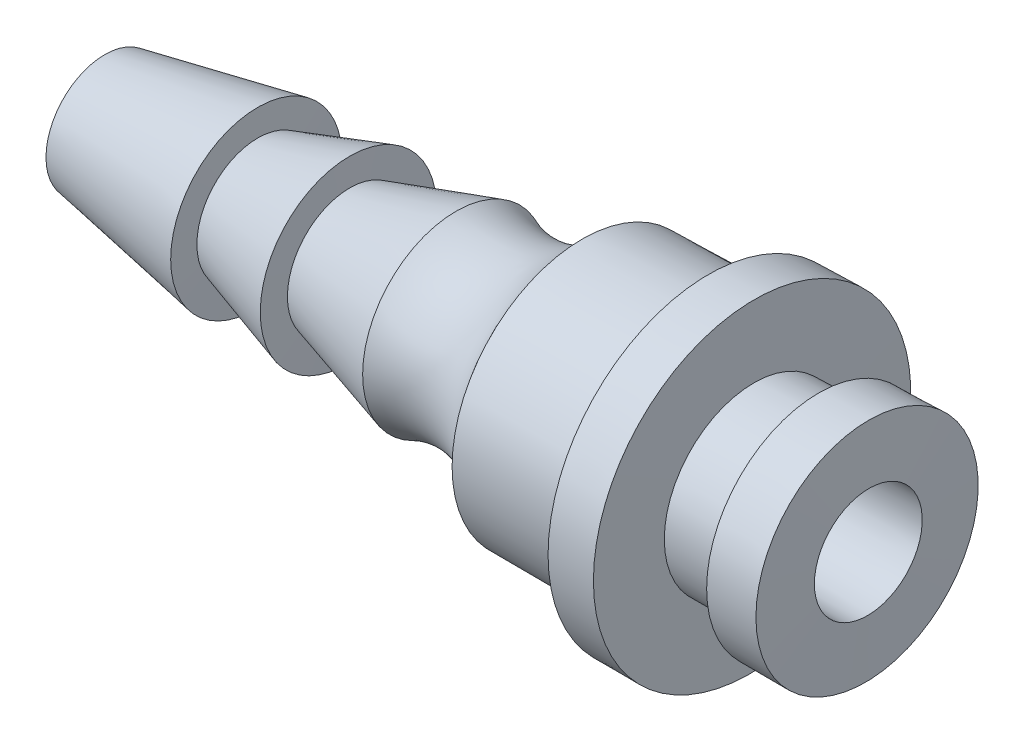
ISO-10303-21;
HEADER;
FILE_DESCRIPTION(('STEP AP214'),'2;1');
FILE_NAME('part.step','',(''),(''),'','','');
FILE_SCHEMA(('AUTOMOTIVE_DESIGN { 1 0 10303 214 1 1 1 1 }'));
ENDSEC;
DATA;
#1=APPLICATION_CONTEXT('core data for automotive mechanical design processes');
#2=APPLICATION_PROTOCOL_DEFINITION('international standard','automotive_design',2000,#1);
#3=PRODUCT_CONTEXT('',#1,'mechanical');
#4=PRODUCT('Part','Part','',(#3));
#5=PRODUCT_RELATED_PRODUCT_CATEGORY('part','',(#4));
#6=PRODUCT_DEFINITION_FORMATION('','',#4);
#7=PRODUCT_DEFINITION_CONTEXT('part definition',#1,'design');
#8=PRODUCT_DEFINITION('design','',#6,#7);
#9=PRODUCT_DEFINITION_SHAPE('','',#8);
#10=(LENGTH_UNIT() NAMED_UNIT(*) SI_UNIT(.MILLI.,.METRE.));
#11=(NAMED_UNIT(*) PLANE_ANGLE_UNIT() SI_UNIT($,.RADIAN.));
#12=(NAMED_UNIT(*) SI_UNIT($,.STERADIAN.) SOLID_ANGLE_UNIT());
#13=UNCERTAINTY_MEASURE_WITH_UNIT(LENGTH_MEASURE(1.E-05),#10,'distance_accuracy_value','');
#14=(GEOMETRIC_REPRESENTATION_CONTEXT(3) GLOBAL_UNCERTAINTY_ASSIGNED_CONTEXT((#13)) GLOBAL_UNIT_ASSIGNED_CONTEXT((#10,
#11,#12)) REPRESENTATION_CONTEXT('',''));
#15=CARTESIAN_POINT('',(0.,0.,0.));
#16=DIRECTION('',(0.,0.,1.));
#17=DIRECTION('',(1.,0.,0.));
#18=AXIS2_PLACEMENT_3D('',#15,#16,#17);
#19=CARTESIAN_POINT('',(-11.5054347686072,0.,0.111037784482097));
#20=DIRECTION('',(-0.999901042595065,0.,0.014067871811395));
#21=DIRECTION('',(0.014067871811395,0.,0.999901042595065));
#22=AXIS2_PLACEMENT_3D('',#19,#20,#21);
#23=CONICAL_SURFACE('',#22,0.849915886205805,1.5567279909251);
#24=CARTESIAN_POINT('',(-11.515421969188,0.,0.111178297044382));
#25=DIRECTION('',(-0.999901042595065,0.,0.014067871811395));
#26=DIRECTION('',(0.014067871811395,0.,0.999901042595065));
#27=AXIS2_PLACEMENT_3D('',#24,#25,#26);
#28=CIRCLE('',#27,1.5598456264483);
#29=CARTESIAN_POINT('',(-11.4934782608696,0.,1.67086956521739));
#30=VERTEX_POINT('',#29);
#31=EDGE_CURVE('E93',#30,#30,#28,.T.);
#32=ORIENTED_EDGE('',*,*,#31,.T.);
#33=EDGE_LOOP('',(#32));
#34=FACE_BOUND('',#33,.T.);
#35=CARTESIAN_POINT('',(-11.5054347686072,0.,0.111037784482097));
#36=DIRECTION('',(-0.999901042595065,0.,0.014067871811395));
#37=DIRECTION('',(0.014067871811395,0.,0.999901042595065));
#38=AXIS2_PLACEMENT_3D('',#35,#36,#37);
#39=CIRCLE('',#38,0.849915886205805);
#40=CARTESIAN_POINT('',(-11.4934782608696,0.,0.960869565217391));
#41=VERTEX_POINT('',#40);
#42=EDGE_CURVE('E10',#41,#41,#39,.T.);
#43=ORIENTED_EDGE('',*,*,#42,.F.);
#44=EDGE_LOOP('',(#43));
#45=FACE_BOUND('',#44,.T.);
#46=ADVANCED_FACE('F35',(#34,#45),#23,.F.);
#47=CARTESIAN_POINT('',(1.39201225666963,0.,-0.0704198035357706));
#48=DIRECTION('',(0.999901042595065,0.,-0.014067871811395));
#49=DIRECTION('',(-0.014067871811395,0.,-0.999901042595065));
#50=AXIS2_PLACEMENT_3D('',#47,#48,#49);
#51=CONICAL_SURFACE('',#50,1.0313914325728,0.014068335869793);
#52=ORIENTED_EDGE('',*,*,#42,.T.);
#53=EDGE_LOOP('',(#52));
#54=FACE_BOUND('',#53,.T.);
#55=CARTESIAN_POINT('',(1.39201225666963,0.,-0.0704198035357706));
#56=DIRECTION('',(-0.999901042595065,0.,0.014067871811395));
#57=DIRECTION('',(0.014067871811395,0.,0.999901042595065));
#58=AXIS2_PLACEMENT_3D('',#55,#56,#57);
#59=CIRCLE('',#58,1.0313914325728);
#60=CARTESIAN_POINT('',(1.40652173913043,0.,0.960869565217391));
#61=VERTEX_POINT('',#60);
#62=EDGE_CURVE('E41',#61,#61,#59,.T.);
#63=ORIENTED_EDGE('',*,*,#62,.F.);
#64=EDGE_LOOP('',(#63));
#65=FACE_BOUND('',#64,.T.);
#66=ADVANCED_FACE('F111',(#54,#65),#51,.F.);
#67=CARTESIAN_POINT('',(1.80711824137701,0.,-0.0762600392513475));
#68=DIRECTION('',(0.999901042595065,0.,-0.014067871811395));
#69=DIRECTION('',(-0.014067871811395,0.,-0.999901042595065));
#70=AXIS2_PLACEMENT_3D('',#67,#68,#69);
#71=CONICAL_SURFACE('',#70,1.35632493531116,0.664099637825054);
#72=ORIENTED_EDGE('',*,*,#62,.T.);
#73=EDGE_LOOP('',(#72));
#74=FACE_BOUND('',#73,.T.);
#75=CARTESIAN_POINT('',(1.80711824137701,0.,-0.0762600392513475));
#76=DIRECTION('',(-0.999901042595065,0.,0.014067871811395));
#77=DIRECTION('',(0.014067871811395,0.,0.999901042595065));
#78=AXIS2_PLACEMENT_3D('',#75,#76,#77);
#79=CIRCLE('',#78,1.35632493531116);
#80=CARTESIAN_POINT('',(1.82619884670156,0.,1.27993067766396));
#81=VERTEX_POINT('',#80);
#82=EDGE_CURVE('E45',#81,#81,#79,.T.);
#83=ORIENTED_EDGE('',*,*,#82,.F.);
#84=EDGE_LOOP('',(#83));
#85=FACE_BOUND('',#84,.T.);
#86=ADVANCED_FACE('F115',(#74,#85),#71,.F.);
#87=CARTESIAN_POINT('',(8.46459473669748,0.,-0.16992583409888));
#88=DIRECTION('',(0.999901042595065,0.,-0.014067871811395));
#89=DIRECTION('',(-0.014067871811395,0.,-0.999901042595065));
#90=AXIS2_PLACEMENT_3D('',#87,#88,#89);
#91=CONICAL_SURFACE('',#90,1.45,0.014068335869793);
#92=ORIENTED_EDGE('',*,*,#82,.T.);
#93=EDGE_LOOP('',(#92));
#94=FACE_BOUND('',#93,.T.);
#95=CARTESIAN_POINT('',(8.46459473669748,0.,-0.16992583409888));
#96=DIRECTION('',(-0.999901042595065,0.,0.014067871811395));
#97=DIRECTION('',(0.014067871811395,0.,0.999901042595065));
#98=AXIS2_PLACEMENT_3D('',#95,#96,#97);
#99=CIRCLE('',#98,1.45);
#100=CARTESIAN_POINT('',(8.484993150824,0.,1.27993067766396));
#101=VERTEX_POINT('',#100);
#102=EDGE_CURVE('E49',#101,#101,#99,.T.);
#103=ORIENTED_EDGE('',*,*,#102,.F.);
#104=EDGE_LOOP('',(#103));
#105=FACE_BOUND('',#104,.T.);
#106=ADVANCED_FACE('F119',(#94,#105),#91,.F.);
#107=CARTESIAN_POINT('',(8.43199945824019,0.,-0.169467242518854));
#108=DIRECTION('',(-0.999901042595065,0.,0.014067871811395));
#109=DIRECTION('',(0.014067871811395,0.,0.999901042595065));
#110=AXIS2_PLACEMENT_3D('',#107,#108,#109);
#111=CONICAL_SURFACE('',#110,2.98838076344962,1.54960935718367);
#112=ORIENTED_EDGE('',*,*,#102,.T.);
#113=EDGE_LOOP('',(#112));
#114=FACE_BOUND('',#113,.T.);
#115=CARTESIAN_POINT('',(8.43199945824019,0.,-0.169467242518854));
#116=DIRECTION('',(-0.999901042595065,0.,0.014067871811395));
#117=DIRECTION('',(0.014067871811395,0.,0.999901042595065));
#118=AXIS2_PLACEMENT_3D('',#115,#116,#117);
#119=CIRCLE('',#118,2.98838076344962);
#120=CARTESIAN_POINT('',(8.47403961574403,0.,2.81861779852546));
#121=VERTEX_POINT('',#120);
#122=EDGE_CURVE('E54',#121,#121,#119,.T.);
#123=ORIENTED_EDGE('',*,*,#122,.F.);
#124=EDGE_LOOP('',(#123));
#125=FACE_BOUND('',#124,.T.);
#126=ADVANCED_FACE('F125',(#114,#125),#111,.T.);
#127=CARTESIAN_POINT('',(7.12568063115012,0.,-0.151088297981882));
#128=DIRECTION('',(0.999901042595065,0.,-0.014067871811395));
#129=DIRECTION('',(-0.014067871811395,0.,-0.999901042595065));
#130=AXIS2_PLACEMENT_3D('',#127,#128,#129);
#131=CONICAL_SURFACE('',#130,2.97,0.0140683358697934);
#132=ORIENTED_EDGE('',*,*,#122,.T.);
#133=EDGE_LOOP('',(#132));
#134=FACE_BOUND('',#133,.T.);
#135=CARTESIAN_POINT('',(7.12568063115012,0.,-0.151088297981882));
#136=DIRECTION('',(-0.999901042595065,0.,0.014067871811395));
#137=DIRECTION('',(0.014067871811395,0.,0.999901042595065));
#138=AXIS2_PLACEMENT_3D('',#135,#136,#137);
#139=CIRCLE('',#138,2.97);
#140=CARTESIAN_POINT('',(7.16746221042996,0.,2.81861779852546));
#141=VERTEX_POINT('',#140);
#142=EDGE_CURVE('E57',#141,#141,#139,.T.);
#143=ORIENTED_EDGE('',*,*,#142,.F.);
#144=EDGE_LOOP('',(#143));
#145=FACE_BOUND('',#144,.T.);
#146=ADVANCED_FACE('F129',(#134,#145),#131,.T.);
#147=CARTESIAN_POINT('',(7.14029198166256,0.,-0.15129386893065));
#148=DIRECTION('',(-0.999901042595065,0.,0.014067871811395));
#149=DIRECTION('',(0.014067871811395,0.,0.999901042595065));
#150=AXIS2_PLACEMENT_3D('',#147,#148,#149);
#151=CONICAL_SURFACE('',#150,2.39891538207937,1.5452141132674);
#152=ORIENTED_EDGE('',*,*,#142,.T.);
#153=EDGE_LOOP('',(#152));
#154=FACE_BOUND('',#153,.T.);
#155=CARTESIAN_POINT('',(7.14029198166256,0.,-0.15129386893065));
#156=DIRECTION('',(-0.999901042595065,0.,0.014067871811395));
#157=DIRECTION('',(0.014067871811395,0.,0.999901042595065));
#158=AXIS2_PLACEMENT_3D('',#155,#156,#157);
#159=CIRCLE('',#158,2.39891538207937);
#160=CARTESIAN_POINT('',(7.17403961574403,0.,2.24738412270785));
#161=VERTEX_POINT('',#160);
#162=EDGE_CURVE('E60',#161,#161,#159,.T.);
#163=ORIENTED_EDGE('',*,*,#162,.F.);
#164=EDGE_LOOP('',(#163));
#165=FACE_BOUND('',#164,.T.);
#166=ADVANCED_FACE('F133',(#154,#165),#151,.F.);
#167=CARTESIAN_POINT('',(5.44062842019197,0.,-0.127380853455427));
#168=DIRECTION('',(0.999901042595065,0.,-0.014067871811395));
#169=DIRECTION('',(-0.014067871811395,0.,-0.999901042595065));
#170=AXIS2_PLACEMENT_3D('',#167,#168,#169);
#171=CONICAL_SURFACE('',#170,2.375,0.0140683358697924);
#172=ORIENTED_EDGE('',*,*,#162,.T.);
#173=EDGE_LOOP('',(#172));
#174=FACE_BOUND('',#173,.T.);
#175=CARTESIAN_POINT('',(5.44062842019197,0.,-0.127380853455427));
#176=DIRECTION('',(-0.999901042595065,0.,0.014067871811395));
#177=DIRECTION('',(0.014067871811395,0.,0.999901042595065));
#178=AXIS2_PLACEMENT_3D('',#175,#176,#177);
#179=CIRCLE('',#178,2.375);
#180=CARTESIAN_POINT('',(5.47403961574403,0.,2.24738412270785));
#181=VERTEX_POINT('',#180);
#182=EDGE_CURVE('E63',#181,#181,#179,.T.);
#183=ORIENTED_EDGE('',*,*,#182,.F.);
#184=EDGE_LOOP('',(#183));
#185=FACE_BOUND('',#184,.T.);
#186=ADVANCED_FACE('F137',(#174,#185),#171,.T.);
#187=CARTESIAN_POINT('',(5.42649537089601,0.,-0.127182011852779));
#188=DIRECTION('',(-0.999901042595065,0.,0.014067871811395));
#189=DIRECTION('',(0.014067871811395,0.,0.999901042595065));
#190=AXIS2_PLACEMENT_3D('',#187,#188,#189);
#191=CONICAL_SURFACE('',#190,4.26691180010591,1.56332547903242);
#192=ORIENTED_EDGE('',*,*,#182,.T.);
#193=EDGE_LOOP('',(#192));
#194=FACE_BOUND('',#193,.T.);
#195=CARTESIAN_POINT('',(5.42649537089601,0.,-0.127182011852779));
#196=DIRECTION('',(-0.999901042595065,0.,0.014067871811395));
#197=DIRECTION('',(0.014067871811395,0.,0.999901042595065));
#198=AXIS2_PLACEMENT_3D('',#195,#196,#197);
#199=CIRCLE('',#198,4.26691180010591);
#200=CARTESIAN_POINT('',(5.48652173913043,0.,4.13930754573431));
#201=VERTEX_POINT('',#200);
#202=EDGE_CURVE('E66',#201,#201,#199,.T.);
#203=ORIENTED_EDGE('',*,*,#202,.F.);
#204=EDGE_LOOP('',(#203));
#205=FACE_BOUND('',#204,.T.);
#206=ADVANCED_FACE('F141',(#194,#205),#191,.T.);
#207=CARTESIAN_POINT('',(4.22457560630702,0.,-0.110271885294717));
#208=DIRECTION('',(0.999901042595065,0.,-0.014067871811395));
#209=DIRECTION('',(-0.014067871811395,0.,-0.999901042595065));
#210=AXIS2_PLACEMENT_3D('',#207,#208,#209);
#211=CONICAL_SURFACE('',#210,4.25,0.0140683358697931);
#212=ORIENTED_EDGE('',*,*,#202,.T.);
#213=EDGE_LOOP('',(#212));
#214=FACE_BOUND('',#213,.T.);
#215=CARTESIAN_POINT('',(4.22457560630702,0.,-0.110271885294717));
#216=DIRECTION('',(-0.999901042595065,0.,0.014067871811395));
#217=DIRECTION('',(0.014067871811395,0.,0.999901042595065));
#218=AXIS2_PLACEMENT_3D('',#215,#216,#217);
#219=CIRCLE('',#218,4.25);
#220=CARTESIAN_POINT('',(4.28436406150545,0.,4.13930754573431));
#221=VERTEX_POINT('',#220);
#222=EDGE_CURVE('E69',#221,#221,#219,.T.);
#223=ORIENTED_EDGE('',*,*,#222,.F.);
#224=EDGE_LOOP('',(#223));
#225=FACE_BOUND('',#224,.T.);
#226=ADVANCED_FACE('F145',(#214,#225),#211,.T.);
#227=CARTESIAN_POINT('',(4.23733449482402,0.,-0.110451393466493));
#228=DIRECTION('',(-0.999901042595065,0.,0.014067871811395));
#229=DIRECTION('',(0.014067871811395,0.,0.999901042595065));
#230=AXIS2_PLACEMENT_3D('',#227,#228,#229);
#231=CONICAL_SURFACE('',#230,3.4964239769776,1.55386514597227);
#232=ORIENTED_EDGE('',*,*,#222,.T.);
#233=EDGE_LOOP('',(#232));
#234=FACE_BOUND('',#233,.T.);
#235=CARTESIAN_POINT('',(4.23733449482402,0.,-0.110451393466493));
#236=DIRECTION('',(-0.999901042595065,0.,0.014067871811395));
#237=DIRECTION('',(0.014067871811395,0.,0.999901042595065));
#238=AXIS2_PLACEMENT_3D('',#235,#236,#237);
#239=CIRCLE('',#238,3.4964239769776);
#240=CARTESIAN_POINT('',(4.28652173913043,0.,3.3856265864678));
#241=VERTEX_POINT('',#240);
#242=EDGE_CURVE('E72',#241,#241,#239,.T.);
#243=ORIENTED_EDGE('',*,*,#242,.F.);
#244=EDGE_LOOP('',(#243));
#245=FACE_BOUND('',#244,.T.);
#246=ADVANCED_FACE('F149',(#234,#245),#231,.F.);
#247=CARTESIAN_POINT('',(0.937987581381122,0.,-0.0640320104851781));
#248=DIRECTION('',(0.999901042595065,0.,-0.014067871811395));
#249=DIRECTION('',(-0.014067871811395,0.,-0.999901042595065));
#250=AXIS2_PLACEMENT_3D('',#247,#248,#249);
#251=CONICAL_SURFACE('',#250,3.45,0.0140683358697929);
#252=ORIENTED_EDGE('',*,*,#242,.T.);
#253=EDGE_LOOP('',(#252));
#254=FACE_BOUND('',#253,.T.);
#255=CARTESIAN_POINT('',(0.937987581381122,0.,-0.0640320104851781));
#256=DIRECTION('',(-0.999901042595065,0.,0.014067871811395));
#257=DIRECTION('',(0.014067871811395,0.,0.999901042595065));
#258=AXIS2_PLACEMENT_3D('',#255,#256,#257);
#259=CIRCLE('',#258,3.45);
#260=CARTESIAN_POINT('',(0.986521739130434,0.,3.3856265864678));
#261=VERTEX_POINT('',#260);
#262=EDGE_CURVE('E75',#261,#261,#259,.T.);
#263=ORIENTED_EDGE('',*,*,#262,.F.);
#264=EDGE_LOOP('',(#263));
#265=FACE_BOUND('',#264,.T.);
#266=ADVANCED_FACE('F153',(#254,#265),#251,.T.);
#267=CARTESIAN_POINT('',(-1.26637714043546,0.,-0.0330182211089871));
#268=DIRECTION('',(-0.999901042595065,0.,0.014067871811395));
#269=DIRECTION('',(0.014067871811395,0.,0.999901042595065));
#270=AXIS2_PLACEMENT_3D('',#267,#268,#269);
#271=TOROIDAL_SURFACE('',#270,4.85450258090152,2.61396503069188);
#272=ORIENTED_EDGE('',*,*,#262,.T.);
#273=EDGE_LOOP('',(#272));
#274=FACE_BOUND('',#273,.T.);
#275=CARTESIAN_POINT('',(-2.34829624360277,0.,-0.0177964155449529));
#276=DIRECTION('',(-0.999901042595065,0.,0.014067871811395));
#277=DIRECTION('',(0.014067871811395,0.,0.999901042595065));
#278=AXIS2_PLACEMENT_3D('',#275,#276,#277);
#279=CIRCLE('',#278,2.475);
#280=CARTESIAN_POINT('',(-2.31347826086957,0.,2.45695866487783));
#281=VERTEX_POINT('',#280);
#282=EDGE_CURVE('E78',#281,#281,#279,.T.);
#283=ORIENTED_EDGE('',*,*,#282,.F.);
#284=EDGE_LOOP('',(#283));
#285=FACE_BOUND('',#284,.T.);
#286=ADVANCED_FACE('F157',(#274,#285),#271,.F.);
#287=CARTESIAN_POINT('',(-5.11668856129874,0.,0.0211528270200131));
#288=DIRECTION('',(0.999901042595065,0.,-0.014067871811395));
#289=DIRECTION('',(-0.014067871811395,0.,-0.999901042595065));
#290=AXIS2_PLACEMENT_3D('',#287,#288,#289);
#291=CONICAL_SURFACE('',#290,1.64988000604123,0.289639976906436);
#292=ORIENTED_EDGE('',*,*,#282,.T.);
#293=EDGE_LOOP('',(#292));
#294=FACE_BOUND('',#293,.T.);
#295=CARTESIAN_POINT('',(-5.11668856129874,0.,0.0211528270200131));
#296=DIRECTION('',(-0.999901042595065,0.,0.014067871811395));
#297=DIRECTION('',(0.014067871811395,0.,0.999901042595065));
#298=AXIS2_PLACEMENT_3D('',#295,#296,#297);
#299=CIRCLE('',#298,1.64988000604123);
#300=CARTESIAN_POINT('',(-5.09347826086957,0.,1.67086956521739));
#301=VERTEX_POINT('',#300);
#302=EDGE_CURVE('E81',#301,#301,#299,.T.);
#303=ORIENTED_EDGE('',*,*,#302,.F.);
#304=EDGE_LOOP('',(#303));
#305=FACE_BOUND('',#304,.T.);
#306=ADVANCED_FACE('F161',(#294,#305),#291,.T.);
#307=CARTESIAN_POINT('',(-5.12681911706257,0.,0.0212953564842228));
#308=DIRECTION('',(-0.999901042595065,0.,0.014067871811395));
#309=DIRECTION('',(0.014067871811395,0.,0.999901042595065));
#310=AXIS2_PLACEMENT_3D('',#307,#308,#309);
#311=CONICAL_SURFACE('',#310,2.36999999999995,1.5567279909251);
#312=ORIENTED_EDGE('',*,*,#302,.T.);
#313=EDGE_LOOP('',(#312));
#314=FACE_BOUND('',#313,.T.);
#315=CARTESIAN_POINT('',(-5.12681911706257,0.,0.0212953564842228));
#316=DIRECTION('',(-0.999901042595065,0.,0.014067871811395));
#317=DIRECTION('',(0.014067871811395,0.,0.999901042595065));
#318=AXIS2_PLACEMENT_3D('',#315,#316,#317);
#319=CIRCLE('',#318,2.36999999999995);
#320=CARTESIAN_POINT('',(-5.09347826086957,0.,2.39106082743448));
#321=VERTEX_POINT('',#320);
#322=EDGE_CURVE('E84',#321,#321,#319,.T.);
#323=ORIENTED_EDGE('',*,*,#322,.F.);
#324=EDGE_LOOP('',(#323));
#325=FACE_BOUND('',#324,.T.);
#326=ADVANCED_FACE('F165',(#314,#325),#311,.T.);
#327=CARTESIAN_POINT('',(-7.51621358925722,0.,0.0549123782791514));
#328=DIRECTION('',(0.999901042595065,0.,-0.014067871811395));
#329=DIRECTION('',(-0.014067871811395,0.,-0.999901042595065));
#330=AXIS2_PLACEMENT_3D('',#327,#328,#329);
#331=CONICAL_SURFACE('',#330,1.61611711369388,0.305598241212241);
#332=ORIENTED_EDGE('',*,*,#322,.T.);
#333=EDGE_LOOP('',(#332));
#334=FACE_BOUND('',#333,.T.);
#335=CARTESIAN_POINT('',(-7.51621358925722,0.,0.0549123782791514));
#336=DIRECTION('',(-0.999901042595065,0.,0.014067871811395));
#337=DIRECTION('',(0.014067871811395,0.,0.999901042595065));
#338=AXIS2_PLACEMENT_3D('',#335,#336,#337);
#339=CIRCLE('',#338,1.61611711369388);
#340=CARTESIAN_POINT('',(-7.49347826086957,0.,1.67086956521739));
#341=VERTEX_POINT('',#340);
#342=EDGE_CURVE('E87',#341,#341,#339,.T.);
#343=ORIENTED_EDGE('',*,*,#342,.F.);
#344=EDGE_LOOP('',(#343));
#345=FACE_BOUND('',#344,.T.);
#346=ADVANCED_FACE('F107',(#334,#345),#331,.T.);
#347=CARTESIAN_POINT('',(-7.53195071693414,0.,0.0551337880841296));
#348=DIRECTION('',(-0.999901042595065,0.,0.014067871811395));
#349=DIRECTION('',(0.014067871811395,0.,0.999901042595065));
#350=AXIS2_PLACEMENT_3D('',#347,#348,#349);
#351=CONICAL_SURFACE('',#350,2.30499999999997,1.54795362315238);
#352=ORIENTED_EDGE('',*,*,#342,.T.);
#353=EDGE_LOOP('',(#352));
#354=FACE_BOUND('',#353,.T.);
#355=CARTESIAN_POINT('',(-7.53195071693414,0.,0.0551337880841296));
#356=DIRECTION('',(-0.999901042595065,0.,0.014067871811395));
#357=DIRECTION('',(0.014067871811395,0.,0.999901042595065));
#358=AXIS2_PLACEMENT_3D('',#355,#356,#357);
#359=CIRCLE('',#358,2.30499999999997);
#360=CARTESIAN_POINT('',(-7.49952427240887,0.,2.35990569126573));
#361=VERTEX_POINT('',#360);
#362=EDGE_CURVE('E90',#361,#361,#359,.T.);
#363=ORIENTED_EDGE('',*,*,#362,.F.);
#364=EDGE_LOOP('',(#363));
#365=FACE_BOUND('',#364,.T.);
#366=ADVANCED_FACE('F101',(#354,#365),#351,.T.);
#367=CARTESIAN_POINT('',(-11.515421969188,0.,0.111178297044382));
#368=DIRECTION('',(0.999901042595065,0.,-0.014067871811395));
#369=DIRECTION('',(-0.014067871811395,0.,-0.999901042595065));
#370=AXIS2_PLACEMENT_3D('',#367,#368,#369);
#371=CONICAL_SURFACE('',#370,1.5598456264483,0.184906487974549);
#372=ORIENTED_EDGE('',*,*,#362,.T.);
#373=EDGE_LOOP('',(#372));
#374=FACE_BOUND('',#373,.T.);
#375=ORIENTED_EDGE('',*,*,#31,.F.);
#376=EDGE_LOOP('',(#375));
#377=FACE_BOUND('',#376,.T.);
#378=ADVANCED_FACE('F99',(#374,#377),#371,.T.);
#379=CLOSED_SHELL('',(#46,#66,#86,#106,#126,#146,#166,#186,#206,#226,#246,#266,#286,#306,#326,
#346,#366,#378));
#380=MANIFOLD_SOLID_BREP('B2',#379);
#381=ADVANCED_BREP_SHAPE_REPRESENTATION('',(#18,#380),#14);
#382=SHAPE_DEFINITION_REPRESENTATION(#9,#381);
ENDSEC;
END-ISO-10303-21;
